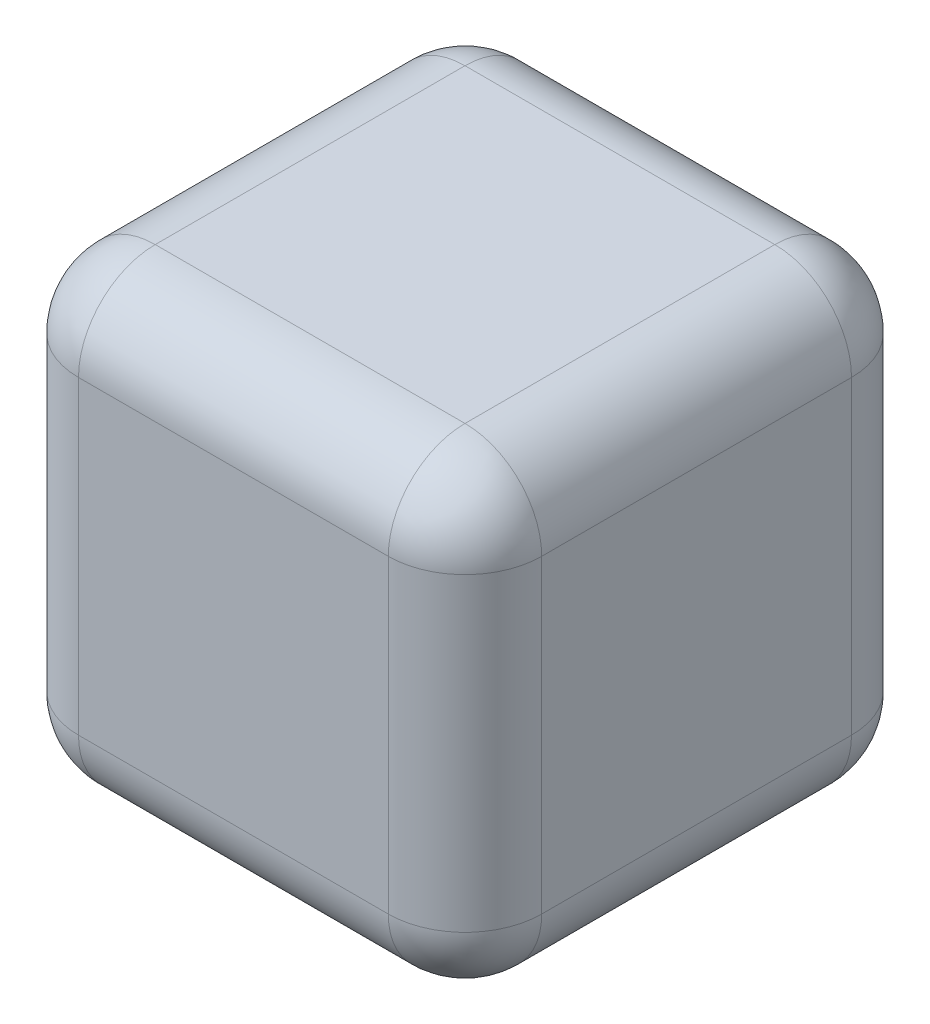
ISO-10303-21;
HEADER;
FILE_DESCRIPTION(('STEP AP214'),'2;1');
FILE_NAME('part.step','',(''),(''),'','','');
FILE_SCHEMA(('AUTOMOTIVE_DESIGN { 1 0 10303 214 1 1 1 1 }'));
ENDSEC;
DATA;
#1=APPLICATION_CONTEXT('core data for automotive mechanical design processes');
#2=APPLICATION_PROTOCOL_DEFINITION('international standard','automotive_design',2000,#1);
#3=PRODUCT_CONTEXT('',#1,'mechanical');
#4=PRODUCT('Part','Part','',(#3));
#5=PRODUCT_RELATED_PRODUCT_CATEGORY('part','',(#4));
#6=PRODUCT_DEFINITION_FORMATION('','',#4);
#7=PRODUCT_DEFINITION_CONTEXT('part definition',#1,'design');
#8=PRODUCT_DEFINITION('design','',#6,#7);
#9=PRODUCT_DEFINITION_SHAPE('','',#8);
#10=(LENGTH_UNIT() NAMED_UNIT(*) SI_UNIT(.MILLI.,.METRE.));
#11=(NAMED_UNIT(*) PLANE_ANGLE_UNIT() SI_UNIT($,.RADIAN.));
#12=(NAMED_UNIT(*) SI_UNIT($,.STERADIAN.) SOLID_ANGLE_UNIT());
#13=UNCERTAINTY_MEASURE_WITH_UNIT(LENGTH_MEASURE(1.E-05),#10,'distance_accuracy_value','');
#14=(GEOMETRIC_REPRESENTATION_CONTEXT(3) GLOBAL_UNCERTAINTY_ASSIGNED_CONTEXT((#13)) GLOBAL_UNIT_ASSIGNED_CONTEXT((#10,
#11,#12)) REPRESENTATION_CONTEXT('',''));
#15=CARTESIAN_POINT('',(0.,0.,0.));
#16=DIRECTION('',(0.,0.,1.));
#17=DIRECTION('',(1.,0.,0.));
#18=AXIS2_PLACEMENT_3D('',#15,#16,#17);
#19=CARTESIAN_POINT('',(32.,-32.,64.));
#20=DIRECTION('',(-1.,0.,0.));
#21=DIRECTION('',(0.,0.,1.));
#22=AXIS2_PLACEMENT_3D('',#19,#20,#21);
#23=PLANE('',#22);
#24=DIRECTION('',(0.,1.,0.));
#25=VECTOR('',#24,1.);
#26=CARTESIAN_POINT('',(32.,-32.,53.4));
#27=LINE('',#26,#25);
#28=CARTESIAN_POINT('',(32.,21.4,53.4));
#29=VERTEX_POINT('',#28);
#30=CARTESIAN_POINT('',(32.,-21.4,53.4));
#31=VERTEX_POINT('',#30);
#32=EDGE_CURVE('E43',#29,#31,#27,.F.);
#33=ORIENTED_EDGE('',*,*,#32,.T.);
#34=DIRECTION('',(0.,0.,-1.));
#35=VECTOR('',#34,1.);
#36=CARTESIAN_POINT('',(32.,-21.4,64.));
#37=LINE('',#36,#35);
#38=CARTESIAN_POINT('',(32.,-21.4,10.6));
#39=VERTEX_POINT('',#38);
#40=EDGE_CURVE('E11',#31,#39,#37,.T.);
#41=ORIENTED_EDGE('',*,*,#40,.T.);
#42=DIRECTION('',(0.,1.,0.));
#43=VECTOR('',#42,1.);
#44=CARTESIAN_POINT('',(32.,32.,10.6));
#45=LINE('',#44,#43);
#46=CARTESIAN_POINT('',(32.,21.4,10.6));
#47=VERTEX_POINT('',#46);
#48=EDGE_CURVE('E236',#39,#47,#45,.T.);
#49=ORIENTED_EDGE('',*,*,#48,.T.);
#50=DIRECTION('',(0.,0.,-1.));
#51=VECTOR('',#50,1.);
#52=CARTESIAN_POINT('',(32.,21.4,64.));
#53=LINE('',#52,#51);
#54=EDGE_CURVE('E54',#47,#29,#53,.F.);
#55=ORIENTED_EDGE('',*,*,#54,.T.);
#56=EDGE_LOOP('',(#33,#41,#49,#55));
#57=FACE_BOUND('',#56,.T.);
#58=ADVANCED_FACE('F34',(#57),#23,.F.);
#59=CARTESIAN_POINT('',(-32.,32.,64.));
#60=DIRECTION('',(0.,-1.,0.));
#61=DIRECTION('',(0.,0.,-1.));
#62=AXIS2_PLACEMENT_3D('',#59,#60,#61);
#63=PLANE('',#62);
#64=DIRECTION('',(-1.,0.,0.));
#65=VECTOR('',#64,1.);
#66=CARTESIAN_POINT('',(-32.,32.,10.6));
#67=LINE('',#66,#65);
#68=CARTESIAN_POINT('',(21.4,32.,10.6));
#69=VERTEX_POINT('',#68);
#70=CARTESIAN_POINT('',(-21.4,32.,10.6));
#71=VERTEX_POINT('',#70);
#72=EDGE_CURVE('E282',#69,#71,#67,.T.);
#73=ORIENTED_EDGE('',*,*,#72,.T.);
#74=DIRECTION('',(0.,0.,-1.));
#75=VECTOR('',#74,1.);
#76=CARTESIAN_POINT('',(-21.4,32.,64.));
#77=LINE('',#76,#75);
#78=CARTESIAN_POINT('',(-21.4,32.,53.4));
#79=VERTEX_POINT('',#78);
#80=EDGE_CURVE('E222',#71,#79,#77,.F.);
#81=ORIENTED_EDGE('',*,*,#80,.T.);
#82=DIRECTION('',(-1.,0.,0.));
#83=VECTOR('',#82,1.);
#84=CARTESIAN_POINT('',(-32.,32.,53.4));
#85=LINE('',#84,#83);
#86=CARTESIAN_POINT('',(21.4,32.,53.4));
#87=VERTEX_POINT('',#86);
#88=EDGE_CURVE('E212',#79,#87,#85,.F.);
#89=ORIENTED_EDGE('',*,*,#88,.T.);
#90=DIRECTION('',(0.,0.,-1.));
#91=VECTOR('',#90,1.);
#92=CARTESIAN_POINT('',(21.4,32.,64.));
#93=LINE('',#92,#91);
#94=EDGE_CURVE('E266',#87,#69,#93,.T.);
#95=ORIENTED_EDGE('',*,*,#94,.T.);
#96=EDGE_LOOP('',(#73,#81,#89,#95));
#97=FACE_BOUND('',#96,.T.);
#98=ADVANCED_FACE('F286',(#97),#63,.F.);
#99=CARTESIAN_POINT('',(-32.,-32.,64.));
#100=DIRECTION('',(1.,0.,0.));
#101=DIRECTION('',(0.,0.,-1.));
#102=AXIS2_PLACEMENT_3D('',#99,#100,#101);
#103=PLANE('',#102);
#104=DIRECTION('',(0.,0.,-1.));
#105=VECTOR('',#104,1.);
#106=CARTESIAN_POINT('',(-32.,-21.4,64.));
#107=LINE('',#106,#105);
#108=CARTESIAN_POINT('',(-32.,-21.4,10.6));
#109=VERTEX_POINT('',#108);
#110=CARTESIAN_POINT('',(-32.,-21.4,53.4));
#111=VERTEX_POINT('',#110);
#112=EDGE_CURVE('E267',#109,#111,#107,.F.);
#113=ORIENTED_EDGE('',*,*,#112,.T.);
#114=DIRECTION('',(0.,-1.,0.));
#115=VECTOR('',#114,1.);
#116=CARTESIAN_POINT('',(-32.,-32.,53.4));
#117=LINE('',#116,#115);
#118=CARTESIAN_POINT('',(-32.,21.4,53.4));
#119=VERTEX_POINT('',#118);
#120=EDGE_CURVE('E261',#111,#119,#117,.F.);
#121=ORIENTED_EDGE('',*,*,#120,.T.);
#122=DIRECTION('',(0.,0.,-1.));
#123=VECTOR('',#122,1.);
#124=CARTESIAN_POINT('',(-32.,21.4,64.));
#125=LINE('',#124,#123);
#126=CARTESIAN_POINT('',(-32.,21.4,10.6));
#127=VERTEX_POINT('',#126);
#128=EDGE_CURVE('E276',#119,#127,#125,.T.);
#129=ORIENTED_EDGE('',*,*,#128,.T.);
#130=DIRECTION('',(0.,-1.,0.));
#131=VECTOR('',#130,1.);
#132=CARTESIAN_POINT('',(-32.,-32.,10.6));
#133=LINE('',#132,#131);
#134=EDGE_CURVE('E272',#127,#109,#133,.T.);
#135=ORIENTED_EDGE('',*,*,#134,.T.);
#136=EDGE_LOOP('',(#113,#121,#129,#135));
#137=FACE_BOUND('',#136,.T.);
#138=ADVANCED_FACE('F270',(#137),#103,.F.);
#139=CARTESIAN_POINT('',(-32.,-32.,64.));
#140=DIRECTION('',(0.,1.,0.));
#141=DIRECTION('',(0.,0.,1.));
#142=AXIS2_PLACEMENT_3D('',#139,#140,#141);
#143=PLANE('',#142);
#144=DIRECTION('',(1.,0.,0.));
#145=VECTOR('',#144,1.);
#146=CARTESIAN_POINT('',(-32.,-32.,53.4));
#147=LINE('',#146,#145);
#148=CARTESIAN_POINT('',(21.4,-32.,53.4));
#149=VERTEX_POINT('',#148);
#150=CARTESIAN_POINT('',(-21.4,-32.,53.4));
#151=VERTEX_POINT('',#150);
#152=EDGE_CURVE('E133',#149,#151,#147,.F.);
#153=ORIENTED_EDGE('',*,*,#152,.T.);
#154=DIRECTION('',(0.,0.,-1.));
#155=VECTOR('',#154,1.);
#156=CARTESIAN_POINT('',(-21.4,-32.,64.));
#157=LINE('',#156,#155);
#158=CARTESIAN_POINT('',(-21.4,-32.,10.6));
#159=VERTEX_POINT('',#158);
#160=EDGE_CURVE('E129',#151,#159,#157,.T.);
#161=ORIENTED_EDGE('',*,*,#160,.T.);
#162=DIRECTION('',(1.,0.,0.));
#163=VECTOR('',#162,1.);
#164=CARTESIAN_POINT('',(32.,-32.,10.6));
#165=LINE('',#164,#163);
#166=CARTESIAN_POINT('',(21.4,-32.,10.6));
#167=VERTEX_POINT('',#166);
#168=EDGE_CURVE('E123',#159,#167,#165,.T.);
#169=ORIENTED_EDGE('',*,*,#168,.T.);
#170=DIRECTION('',(0.,0.,-1.));
#171=VECTOR('',#170,1.);
#172=CARTESIAN_POINT('',(21.4,-32.,64.));
#173=LINE('',#172,#171);
#174=EDGE_CURVE('E126',#167,#149,#173,.F.);
#175=ORIENTED_EDGE('',*,*,#174,.T.);
#176=EDGE_LOOP('',(#153,#161,#169,#175));
#177=FACE_BOUND('',#176,.T.);
#178=ADVANCED_FACE('F125',(#177),#143,.F.);
#179=CARTESIAN_POINT('',(0.,0.,64.));
#180=DIRECTION('',(0.,0.,-1.));
#181=DIRECTION('',(-1.,0.,0.));
#182=AXIS2_PLACEMENT_3D('',#179,#180,#181);
#183=PLANE('',#182);
#184=DIRECTION('',(0.,-1.,0.));
#185=VECTOR('',#184,1.);
#186=CARTESIAN_POINT('',(-21.4,0.,64.));
#187=LINE('',#186,#185);
#188=CARTESIAN_POINT('',(-21.4,21.4,64.));
#189=VERTEX_POINT('',#188);
#190=CARTESIAN_POINT('',(-21.4,-21.4,64.));
#191=VERTEX_POINT('',#190);
#192=EDGE_CURVE('E217',#189,#191,#187,.T.);
#193=ORIENTED_EDGE('',*,*,#192,.T.);
#194=DIRECTION('',(1.,0.,0.));
#195=VECTOR('',#194,1.);
#196=CARTESIAN_POINT('',(0.,-21.4,64.));
#197=LINE('',#196,#195);
#198=CARTESIAN_POINT('',(21.4,-21.4,64.));
#199=VERTEX_POINT('',#198);
#200=EDGE_CURVE('E220',#191,#199,#197,.T.);
#201=ORIENTED_EDGE('',*,*,#200,.T.);
#202=DIRECTION('',(0.,1.,0.));
#203=VECTOR('',#202,1.);
#204=CARTESIAN_POINT('',(21.4,0.,64.));
#205=LINE('',#204,#203);
#206=CARTESIAN_POINT('',(21.4,21.4,64.));
#207=VERTEX_POINT('',#206);
#208=EDGE_CURVE('E218',#199,#207,#205,.T.);
#209=ORIENTED_EDGE('',*,*,#208,.T.);
#210=DIRECTION('',(-1.,0.,0.));
#211=VECTOR('',#210,1.);
#212=CARTESIAN_POINT('',(0.,21.4,64.));
#213=LINE('',#212,#211);
#214=EDGE_CURVE('E214',#207,#189,#213,.T.);
#215=ORIENTED_EDGE('',*,*,#214,.T.);
#216=EDGE_LOOP('',(#193,#201,#209,#215));
#217=FACE_BOUND('',#216,.T.);
#218=ADVANCED_FACE('F308',(#217),#183,.F.);
#219=CARTESIAN_POINT('',(0.,0.,0.));
#220=DIRECTION('',(0.,0.,-1.));
#221=DIRECTION('',(-1.,0.,0.));
#222=AXIS2_PLACEMENT_3D('',#219,#220,#221);
#223=PLANE('',#222);
#224=DIRECTION('',(0.,-1.,0.));
#225=VECTOR('',#224,1.);
#226=CARTESIAN_POINT('',(-21.4,32.,0.));
#227=LINE('',#226,#225);
#228=CARTESIAN_POINT('',(-21.4,-21.4,0.));
#229=VERTEX_POINT('',#228);
#230=CARTESIAN_POINT('',(-21.4,21.4,0.));
#231=VERTEX_POINT('',#230);
#232=EDGE_CURVE('E231',#229,#231,#227,.F.);
#233=ORIENTED_EDGE('',*,*,#232,.T.);
#234=DIRECTION('',(-1.,0.,0.));
#235=VECTOR('',#234,1.);
#236=CARTESIAN_POINT('',(32.,21.4,0.));
#237=LINE('',#236,#235);
#238=CARTESIAN_POINT('',(21.4,21.4,0.));
#239=VERTEX_POINT('',#238);
#240=EDGE_CURVE('E233',#231,#239,#237,.F.);
#241=ORIENTED_EDGE('',*,*,#240,.T.);
#242=DIRECTION('',(0.,1.,0.));
#243=VECTOR('',#242,1.);
#244=CARTESIAN_POINT('',(21.4,-32.,0.));
#245=LINE('',#244,#243);
#246=CARTESIAN_POINT('',(21.4,-21.4,0.));
#247=VERTEX_POINT('',#246);
#248=EDGE_CURVE('E228',#239,#247,#245,.F.);
#249=ORIENTED_EDGE('',*,*,#248,.T.);
#250=DIRECTION('',(1.,0.,0.));
#251=VECTOR('',#250,1.);
#252=CARTESIAN_POINT('',(-32.,-21.4,0.));
#253=LINE('',#252,#251);
#254=EDGE_CURVE('E154',#247,#229,#253,.F.);
#255=ORIENTED_EDGE('',*,*,#254,.T.);
#256=EDGE_LOOP('',(#233,#241,#249,#255));
#257=FACE_BOUND('',#256,.T.);
#258=ADVANCED_FACE('F478',(#257),#223,.T.);
#259=CARTESIAN_POINT('',(21.4,21.4,64.));
#260=DIRECTION('',(0.,0.,-1.));
#261=DIRECTION('',(-1.,0.,0.));
#262=AXIS2_PLACEMENT_3D('',#259,#260,#261);
#263=CYLINDRICAL_SURFACE('',#262,10.6);
#264=CARTESIAN_POINT('',(21.4,21.4,53.4));
#265=DIRECTION('',(0.,0.,1.));
#266=DIRECTION('',(1.,0.,0.));
#267=AXIS2_PLACEMENT_3D('',#264,#265,#266);
#268=CIRCLE('',#267,10.6);
#269=EDGE_CURVE('E38',#29,#87,#268,.T.);
#270=ORIENTED_EDGE('',*,*,#269,.F.);
#271=ORIENTED_EDGE('',*,*,#54,.F.);
#272=CARTESIAN_POINT('',(21.4,21.4,10.6));
#273=DIRECTION('',(0.,0.,-1.));
#274=DIRECTION('',(-1.,0.,0.));
#275=AXIS2_PLACEMENT_3D('',#272,#273,#274);
#276=CIRCLE('',#275,10.6);
#277=EDGE_CURVE('E194',#69,#47,#276,.T.);
#278=ORIENTED_EDGE('',*,*,#277,.F.);
#279=ORIENTED_EDGE('',*,*,#94,.F.);
#280=EDGE_LOOP('',(#270,#271,#278,#279));
#281=FACE_BOUND('',#280,.T.);
#282=ADVANCED_FACE('F36',(#281),#263,.T.);
#283=CARTESIAN_POINT('',(21.4,21.4,53.4));
#284=DIRECTION('',(0.,0.,1.));
#285=DIRECTION('',(1.,0.,0.));
#286=AXIS2_PLACEMENT_3D('',#283,#284,#285);
#287=SPHERICAL_SURFACE('',#286,10.6);
#288=CARTESIAN_POINT('',(21.4,21.4,53.4));
#289=DIRECTION('',(0.,1.,0.));
#290=DIRECTION('',(0.,0.,1.));
#291=AXIS2_PLACEMENT_3D('',#288,#289,#290);
#292=CIRCLE('',#291,10.6);
#293=EDGE_CURVE('E189',#29,#207,#292,.F.);
#294=ORIENTED_EDGE('',*,*,#293,.F.);
#295=ORIENTED_EDGE('',*,*,#269,.T.);
#296=CARTESIAN_POINT('',(21.4,21.4,53.4));
#297=DIRECTION('',(1.,0.,0.));
#298=DIRECTION('',(0.,0.,-1.));
#299=AXIS2_PLACEMENT_3D('',#296,#297,#298);
#300=CIRCLE('',#299,10.6);
#301=EDGE_CURVE('E192',#207,#87,#300,.F.);
#302=ORIENTED_EDGE('',*,*,#301,.F.);
#303=EDGE_LOOP('',(#294,#295,#302));
#304=FACE_BOUND('',#303,.T.);
#305=ADVANCED_FACE('F204',(#304),#287,.T.);
#306=CARTESIAN_POINT('',(21.4,21.4,10.6));
#307=DIRECTION('',(0.,0.,1.));
#308=DIRECTION('',(1.,0.,0.));
#309=AXIS2_PLACEMENT_3D('',#306,#307,#308);
#310=SPHERICAL_SURFACE('',#309,10.6);
#311=CARTESIAN_POINT('',(21.4,21.4,10.6));
#312=DIRECTION('',(1.,0.,0.));
#313=DIRECTION('',(0.,0.,-1.));
#314=AXIS2_PLACEMENT_3D('',#311,#312,#313);
#315=CIRCLE('',#314,10.6);
#316=EDGE_CURVE('E183',#69,#239,#315,.F.);
#317=ORIENTED_EDGE('',*,*,#316,.F.);
#318=ORIENTED_EDGE('',*,*,#277,.T.);
#319=CARTESIAN_POINT('',(21.4,21.4,10.6));
#320=DIRECTION('',(0.,1.,0.));
#321=DIRECTION('',(0.,0.,1.));
#322=AXIS2_PLACEMENT_3D('',#319,#320,#321);
#323=CIRCLE('',#322,10.6);
#324=EDGE_CURVE('E186',#239,#47,#323,.F.);
#325=ORIENTED_EDGE('',*,*,#324,.F.);
#326=EDGE_LOOP('',(#317,#318,#325));
#327=FACE_BOUND('',#326,.T.);
#328=ADVANCED_FACE('F457',(#327),#310,.T.);
#329=CARTESIAN_POINT('',(0.,21.4,53.4));
#330=DIRECTION('',(-1.,0.,0.));
#331=DIRECTION('',(0.,0.,1.));
#332=AXIS2_PLACEMENT_3D('',#329,#330,#331);
#333=CYLINDRICAL_SURFACE('',#332,10.6);
#334=ORIENTED_EDGE('',*,*,#301,.T.);
#335=ORIENTED_EDGE('',*,*,#88,.F.);
#336=CARTESIAN_POINT('',(-21.4,21.4,53.4));
#337=DIRECTION('',(-1.,0.,0.));
#338=DIRECTION('',(0.,0.,1.));
#339=AXIS2_PLACEMENT_3D('',#336,#337,#338);
#340=CIRCLE('',#339,10.6);
#341=EDGE_CURVE('E178',#189,#79,#340,.T.);
#342=ORIENTED_EDGE('',*,*,#341,.F.);
#343=ORIENTED_EDGE('',*,*,#214,.F.);
#344=EDGE_LOOP('',(#334,#335,#342,#343));
#345=FACE_BOUND('',#344,.T.);
#346=ADVANCED_FACE('F210',(#345),#333,.T.);
#347=CARTESIAN_POINT('',(21.4,0.,53.4));
#348=DIRECTION('',(0.,1.,0.));
#349=DIRECTION('',(0.,0.,1.));
#350=AXIS2_PLACEMENT_3D('',#347,#348,#349);
#351=CYLINDRICAL_SURFACE('',#350,10.6);
#352=ORIENTED_EDGE('',*,*,#293,.T.);
#353=ORIENTED_EDGE('',*,*,#208,.F.);
#354=CARTESIAN_POINT('',(21.4,-21.4,53.4));
#355=DIRECTION('',(0.,-1.,0.));
#356=DIRECTION('',(0.,0.,-1.));
#357=AXIS2_PLACEMENT_3D('',#354,#355,#356);
#358=CIRCLE('',#357,10.6);
#359=EDGE_CURVE('E175',#31,#199,#358,.T.);
#360=ORIENTED_EDGE('',*,*,#359,.F.);
#361=ORIENTED_EDGE('',*,*,#32,.F.);
#362=EDGE_LOOP('',(#352,#353,#360,#361));
#363=FACE_BOUND('',#362,.T.);
#364=ADVANCED_FACE('F312',(#363),#351,.T.);
#365=CARTESIAN_POINT('',(21.4,-21.4,64.));
#366=DIRECTION('',(0.,0.,-1.));
#367=DIRECTION('',(-1.,0.,0.));
#368=AXIS2_PLACEMENT_3D('',#365,#366,#367);
#369=CYLINDRICAL_SURFACE('',#368,10.6);
#370=CARTESIAN_POINT('',(21.4,-21.4,10.6));
#371=DIRECTION('',(0.,0.,-1.));
#372=DIRECTION('',(-1.,0.,0.));
#373=AXIS2_PLACEMENT_3D('',#370,#371,#372);
#374=CIRCLE('',#373,10.6);
#375=EDGE_CURVE('E139',#39,#167,#374,.T.);
#376=ORIENTED_EDGE('',*,*,#375,.F.);
#377=ORIENTED_EDGE('',*,*,#40,.F.);
#378=CARTESIAN_POINT('',(21.4,-21.4,53.4));
#379=DIRECTION('',(0.,0.,1.));
#380=DIRECTION('',(1.,0.,0.));
#381=AXIS2_PLACEMENT_3D('',#378,#379,#380);
#382=CIRCLE('',#381,10.6);
#383=EDGE_CURVE('E142',#149,#31,#382,.T.);
#384=ORIENTED_EDGE('',*,*,#383,.F.);
#385=ORIENTED_EDGE('',*,*,#174,.F.);
#386=EDGE_LOOP('',(#376,#377,#384,#385));
#387=FACE_BOUND('',#386,.T.);
#388=ADVANCED_FACE('F138',(#387),#369,.T.);
#389=CARTESIAN_POINT('',(21.4,-32.,10.6));
#390=DIRECTION('',(0.,-1.,0.));
#391=DIRECTION('',(0.,0.,-1.));
#392=AXIS2_PLACEMENT_3D('',#389,#390,#391);
#393=CYLINDRICAL_SURFACE('',#392,10.6);
#394=ORIENTED_EDGE('',*,*,#324,.T.);
#395=ORIENTED_EDGE('',*,*,#48,.F.);
#396=CARTESIAN_POINT('',(21.4,-21.4,10.6));
#397=DIRECTION('',(0.,-1.,0.));
#398=DIRECTION('',(0.,0.,-1.));
#399=AXIS2_PLACEMENT_3D('',#396,#397,#398);
#400=CIRCLE('',#399,10.6);
#401=EDGE_CURVE('E151',#247,#39,#400,.T.);
#402=ORIENTED_EDGE('',*,*,#401,.F.);
#403=ORIENTED_EDGE('',*,*,#248,.F.);
#404=EDGE_LOOP('',(#394,#395,#402,#403));
#405=FACE_BOUND('',#404,.T.);
#406=ADVANCED_FACE('F427',(#405),#393,.T.);
#407=CARTESIAN_POINT('',(-32.,21.4,10.6));
#408=DIRECTION('',(1.,0.,0.));
#409=DIRECTION('',(0.,0.,-1.));
#410=AXIS2_PLACEMENT_3D('',#407,#408,#409);
#411=CYLINDRICAL_SURFACE('',#410,10.6);
#412=ORIENTED_EDGE('',*,*,#316,.T.);
#413=ORIENTED_EDGE('',*,*,#240,.F.);
#414=CARTESIAN_POINT('',(-21.4,21.4,10.6));
#415=DIRECTION('',(-1.,0.,0.));
#416=DIRECTION('',(0.,0.,1.));
#417=AXIS2_PLACEMENT_3D('',#414,#415,#416);
#418=CIRCLE('',#417,10.6);
#419=EDGE_CURVE('E170',#71,#231,#418,.T.);
#420=ORIENTED_EDGE('',*,*,#419,.F.);
#421=ORIENTED_EDGE('',*,*,#72,.F.);
#422=EDGE_LOOP('',(#412,#413,#420,#421));
#423=FACE_BOUND('',#422,.T.);
#424=ADVANCED_FACE('F296',(#423),#411,.T.);
#425=CARTESIAN_POINT('',(-21.4,21.4,64.));
#426=DIRECTION('',(0.,0.,-1.));
#427=DIRECTION('',(-1.,0.,0.));
#428=AXIS2_PLACEMENT_3D('',#425,#426,#427);
#429=CYLINDRICAL_SURFACE('',#428,10.6);
#430=CARTESIAN_POINT('',(-21.4,21.4,53.4));
#431=DIRECTION('',(0.,0.,1.));
#432=DIRECTION('',(1.,0.,0.));
#433=AXIS2_PLACEMENT_3D('',#430,#431,#432);
#434=CIRCLE('',#433,10.6);
#435=EDGE_CURVE('E180',#79,#119,#434,.T.);
#436=ORIENTED_EDGE('',*,*,#435,.F.);
#437=ORIENTED_EDGE('',*,*,#80,.F.);
#438=CARTESIAN_POINT('',(-21.4,21.4,10.6));
#439=DIRECTION('',(0.,0.,-1.));
#440=DIRECTION('',(-1.,0.,0.));
#441=AXIS2_PLACEMENT_3D('',#438,#439,#440);
#442=CIRCLE('',#441,10.6);
#443=EDGE_CURVE('E167',#127,#71,#442,.T.);
#444=ORIENTED_EDGE('',*,*,#443,.F.);
#445=ORIENTED_EDGE('',*,*,#128,.F.);
#446=EDGE_LOOP('',(#436,#437,#444,#445));
#447=FACE_BOUND('',#446,.T.);
#448=ADVANCED_FACE('F292',(#447),#429,.T.);
#449=CARTESIAN_POINT('',(-21.4,21.4,53.4));
#450=DIRECTION('',(0.,0.,1.));
#451=DIRECTION('',(1.,0.,0.));
#452=AXIS2_PLACEMENT_3D('',#449,#450,#451);
#453=SPHERICAL_SURFACE('',#452,10.6);
#454=ORIENTED_EDGE('',*,*,#341,.T.);
#455=ORIENTED_EDGE('',*,*,#435,.T.);
#456=CARTESIAN_POINT('',(-21.4,21.4,53.4));
#457=DIRECTION('',(0.,1.,0.));
#458=DIRECTION('',(0.,0.,1.));
#459=AXIS2_PLACEMENT_3D('',#456,#457,#458);
#460=CIRCLE('',#459,10.6);
#461=EDGE_CURVE('E158',#189,#119,#460,.F.);
#462=ORIENTED_EDGE('',*,*,#461,.F.);
#463=EDGE_LOOP('',(#454,#455,#462));
#464=FACE_BOUND('',#463,.T.);
#465=ADVANCED_FACE('F316',(#464),#453,.T.);
#466=CARTESIAN_POINT('',(21.4,-21.4,53.4));
#467=DIRECTION('',(0.,0.,1.));
#468=DIRECTION('',(1.,0.,0.));
#469=AXIS2_PLACEMENT_3D('',#466,#467,#468);
#470=SPHERICAL_SURFACE('',#469,10.6);
#471=ORIENTED_EDGE('',*,*,#383,.T.);
#472=ORIENTED_EDGE('',*,*,#359,.T.);
#473=CARTESIAN_POINT('',(21.4,-21.4,53.4));
#474=DIRECTION('',(1.,0.,0.));
#475=DIRECTION('',(0.,0.,-1.));
#476=AXIS2_PLACEMENT_3D('',#473,#474,#475);
#477=CIRCLE('',#476,10.6);
#478=EDGE_CURVE('E155',#149,#199,#477,.F.);
#479=ORIENTED_EDGE('',*,*,#478,.F.);
#480=EDGE_LOOP('',(#471,#472,#479));
#481=FACE_BOUND('',#480,.T.);
#482=ADVANCED_FACE('F314',(#481),#470,.T.);
#483=CARTESIAN_POINT('',(21.4,-21.4,10.6));
#484=DIRECTION('',(0.,0.,1.));
#485=DIRECTION('',(1.,0.,0.));
#486=AXIS2_PLACEMENT_3D('',#483,#484,#485);
#487=SPHERICAL_SURFACE('',#486,10.6);
#488=ORIENTED_EDGE('',*,*,#401,.T.);
#489=ORIENTED_EDGE('',*,*,#375,.T.);
#490=CARTESIAN_POINT('',(21.4,-21.4,10.6));
#491=DIRECTION('',(1.,0.,0.));
#492=DIRECTION('',(0.,0.,-1.));
#493=AXIS2_PLACEMENT_3D('',#490,#491,#492);
#494=CIRCLE('',#493,10.6);
#495=EDGE_CURVE('E148',#247,#167,#494,.F.);
#496=ORIENTED_EDGE('',*,*,#495,.F.);
#497=EDGE_LOOP('',(#488,#489,#496));
#498=FACE_BOUND('',#497,.T.);
#499=ADVANCED_FACE('F147',(#498),#487,.T.);
#500=CARTESIAN_POINT('',(-21.4,21.4,10.6));
#501=DIRECTION('',(0.,0.,1.));
#502=DIRECTION('',(1.,0.,0.));
#503=AXIS2_PLACEMENT_3D('',#500,#501,#502);
#504=SPHERICAL_SURFACE('',#503,10.6);
#505=ORIENTED_EDGE('',*,*,#443,.T.);
#506=ORIENTED_EDGE('',*,*,#419,.T.);
#507=CARTESIAN_POINT('',(-21.4,21.4,10.6));
#508=DIRECTION('',(0.,1.,0.));
#509=DIRECTION('',(0.,0.,1.));
#510=AXIS2_PLACEMENT_3D('',#507,#508,#509);
#511=CIRCLE('',#510,10.6);
#512=EDGE_CURVE('E156',#127,#231,#511,.F.);
#513=ORIENTED_EDGE('',*,*,#512,.F.);
#514=EDGE_LOOP('',(#505,#506,#513));
#515=FACE_BOUND('',#514,.T.);
#516=ADVANCED_FACE('F298',(#515),#504,.T.);
#517=CARTESIAN_POINT('',(-21.4,0.,53.4));
#518=DIRECTION('',(0.,-1.,0.));
#519=DIRECTION('',(0.,0.,-1.));
#520=AXIS2_PLACEMENT_3D('',#517,#518,#519);
#521=CYLINDRICAL_SURFACE('',#520,10.6);
#522=ORIENTED_EDGE('',*,*,#461,.T.);
#523=ORIENTED_EDGE('',*,*,#120,.F.);
#524=CARTESIAN_POINT('',(-21.4,-21.4,53.4));
#525=DIRECTION('',(0.,-1.,0.));
#526=DIRECTION('',(0.,0.,-1.));
#527=AXIS2_PLACEMENT_3D('',#524,#525,#526);
#528=CIRCLE('',#527,10.6);
#529=EDGE_CURVE('E161',#191,#111,#528,.T.);
#530=ORIENTED_EDGE('',*,*,#529,.F.);
#531=ORIENTED_EDGE('',*,*,#192,.F.);
#532=EDGE_LOOP('',(#522,#523,#530,#531));
#533=FACE_BOUND('',#532,.T.);
#534=ADVANCED_FACE('F263',(#533),#521,.T.);
#535=CARTESIAN_POINT('',(0.,-21.4,53.4));
#536=DIRECTION('',(1.,0.,0.));
#537=DIRECTION('',(0.,0.,-1.));
#538=AXIS2_PLACEMENT_3D('',#535,#536,#537);
#539=CYLINDRICAL_SURFACE('',#538,10.6);
#540=ORIENTED_EDGE('',*,*,#478,.T.);
#541=ORIENTED_EDGE('',*,*,#200,.F.);
#542=CARTESIAN_POINT('',(-21.4,-21.4,53.4));
#543=DIRECTION('',(-1.,0.,0.));
#544=DIRECTION('',(0.,0.,1.));
#545=AXIS2_PLACEMENT_3D('',#542,#543,#544);
#546=CIRCLE('',#545,10.6);
#547=EDGE_CURVE('E250',#151,#191,#546,.T.);
#548=ORIENTED_EDGE('',*,*,#547,.F.);
#549=ORIENTED_EDGE('',*,*,#152,.F.);
#550=EDGE_LOOP('',(#540,#541,#548,#549));
#551=FACE_BOUND('',#550,.T.);
#552=ADVANCED_FACE('F307',(#551),#539,.T.);
#553=CARTESIAN_POINT('',(-32.,-21.4,10.6));
#554=DIRECTION('',(-1.,0.,0.));
#555=DIRECTION('',(0.,0.,1.));
#556=AXIS2_PLACEMENT_3D('',#553,#554,#555);
#557=CYLINDRICAL_SURFACE('',#556,10.6);
#558=ORIENTED_EDGE('',*,*,#495,.T.);
#559=ORIENTED_EDGE('',*,*,#168,.F.);
#560=CARTESIAN_POINT('',(-21.4,-21.4,10.6));
#561=DIRECTION('',(-1.,0.,0.));
#562=DIRECTION('',(0.,0.,1.));
#563=AXIS2_PLACEMENT_3D('',#560,#561,#562);
#564=CIRCLE('',#563,10.6);
#565=EDGE_CURVE('E247',#229,#159,#564,.T.);
#566=ORIENTED_EDGE('',*,*,#565,.F.);
#567=ORIENTED_EDGE('',*,*,#254,.F.);
#568=EDGE_LOOP('',(#558,#559,#566,#567));
#569=FACE_BOUND('',#568,.T.);
#570=ADVANCED_FACE('F153',(#569),#557,.T.);
#571=CARTESIAN_POINT('',(-21.4,-32.,10.6));
#572=DIRECTION('',(0.,1.,0.));
#573=DIRECTION('',(0.,0.,1.));
#574=AXIS2_PLACEMENT_3D('',#571,#572,#573);
#575=CYLINDRICAL_SURFACE('',#574,10.6);
#576=ORIENTED_EDGE('',*,*,#512,.T.);
#577=ORIENTED_EDGE('',*,*,#232,.F.);
#578=CARTESIAN_POINT('',(-21.4,-21.4,10.6));
#579=DIRECTION('',(0.,-1.,0.));
#580=DIRECTION('',(0.,0.,-1.));
#581=AXIS2_PLACEMENT_3D('',#578,#579,#580);
#582=CIRCLE('',#581,10.6);
#583=EDGE_CURVE('E244',#109,#229,#582,.T.);
#584=ORIENTED_EDGE('',*,*,#583,.F.);
#585=ORIENTED_EDGE('',*,*,#134,.F.);
#586=EDGE_LOOP('',(#576,#577,#584,#585));
#587=FACE_BOUND('',#586,.T.);
#588=ADVANCED_FACE('F301',(#587),#575,.T.);
#589=CARTESIAN_POINT('',(-21.4,-21.4,53.4));
#590=DIRECTION('',(0.,0.,1.));
#591=DIRECTION('',(1.,0.,0.));
#592=AXIS2_PLACEMENT_3D('',#589,#590,#591);
#593=SPHERICAL_SURFACE('',#592,10.6);
#594=ORIENTED_EDGE('',*,*,#547,.T.);
#595=ORIENTED_EDGE('',*,*,#529,.T.);
#596=CARTESIAN_POINT('',(-21.4,-21.4,53.4));
#597=DIRECTION('',(0.,0.,1.));
#598=DIRECTION('',(1.,0.,0.));
#599=AXIS2_PLACEMENT_3D('',#596,#597,#598);
#600=CIRCLE('',#599,10.6);
#601=EDGE_CURVE('E242',#151,#111,#600,.F.);
#602=ORIENTED_EDGE('',*,*,#601,.F.);
#603=EDGE_LOOP('',(#594,#595,#602));
#604=FACE_BOUND('',#603,.T.);
#605=ADVANCED_FACE('F257',(#604),#593,.T.);
#606=CARTESIAN_POINT('',(-21.4,-21.4,10.6));
#607=DIRECTION('',(0.,0.,1.));
#608=DIRECTION('',(1.,0.,0.));
#609=AXIS2_PLACEMENT_3D('',#606,#607,#608);
#610=SPHERICAL_SURFACE('',#609,10.6);
#611=ORIENTED_EDGE('',*,*,#583,.T.);
#612=ORIENTED_EDGE('',*,*,#565,.T.);
#613=CARTESIAN_POINT('',(-21.4,-21.4,10.6));
#614=DIRECTION('',(0.,0.,-1.));
#615=DIRECTION('',(-1.,0.,0.));
#616=AXIS2_PLACEMENT_3D('',#613,#614,#615);
#617=CIRCLE('',#616,10.6);
#618=EDGE_CURVE('E240',#109,#159,#617,.F.);
#619=ORIENTED_EDGE('',*,*,#618,.F.);
#620=EDGE_LOOP('',(#611,#612,#619));
#621=FACE_BOUND('',#620,.T.);
#622=ADVANCED_FACE('F336',(#621),#610,.T.);
#623=CARTESIAN_POINT('',(-21.4,-21.4,64.));
#624=DIRECTION('',(0.,0.,-1.));
#625=DIRECTION('',(-1.,0.,0.));
#626=AXIS2_PLACEMENT_3D('',#623,#624,#625);
#627=CYLINDRICAL_SURFACE('',#626,10.6);
#628=ORIENTED_EDGE('',*,*,#601,.T.);
#629=ORIENTED_EDGE('',*,*,#112,.F.);
#630=ORIENTED_EDGE('',*,*,#618,.T.);
#631=ORIENTED_EDGE('',*,*,#160,.F.);
#632=EDGE_LOOP('',(#628,#629,#630,#631));
#633=FACE_BOUND('',#632,.T.);
#634=ADVANCED_FACE('F333',(#633),#627,.T.);
#635=CLOSED_SHELL('',(#58,#98,#138,#178,#218,#258,#282,#305,#328,#346,#364,#388,#406,#424,#448,
#465,#482,#499,#516,#534,#552,#570,#588,#605,#622,#634));
#636=MANIFOLD_SOLID_BREP('B2',#635);
#637=ADVANCED_BREP_SHAPE_REPRESENTATION('',(#18,#636),#14);
#638=SHAPE_DEFINITION_REPRESENTATION(#9,#637);
ENDSEC;
END-ISO-10303-21;
